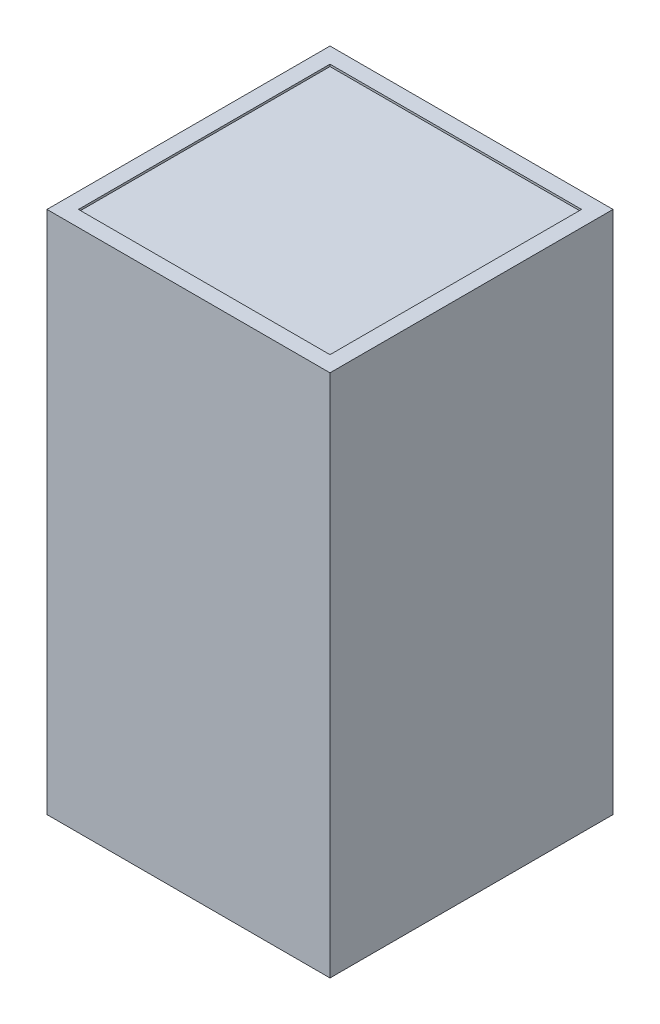
ISO-10303-21;
HEADER;
FILE_DESCRIPTION(('STEP AP214'),'2;1');
FILE_NAME('part.step','',(''),(''),'','','');
FILE_SCHEMA(('AUTOMOTIVE_DESIGN { 1 0 10303 214 1 1 1 1 }'));
ENDSEC;
DATA;
#1=APPLICATION_CONTEXT('core data for automotive mechanical design processes');
#2=APPLICATION_PROTOCOL_DEFINITION('international standard','automotive_design',2000,#1);
#3=PRODUCT_CONTEXT('',#1,'mechanical');
#4=PRODUCT('Part','Part','',(#3));
#5=PRODUCT_RELATED_PRODUCT_CATEGORY('part','',(#4));
#6=PRODUCT_DEFINITION_FORMATION('','',#4);
#7=PRODUCT_DEFINITION_CONTEXT('part definition',#1,'design');
#8=PRODUCT_DEFINITION('design','',#6,#7);
#9=PRODUCT_DEFINITION_SHAPE('','',#8);
#10=(LENGTH_UNIT() NAMED_UNIT(*) SI_UNIT(.MILLI.,.METRE.));
#11=(NAMED_UNIT(*) PLANE_ANGLE_UNIT() SI_UNIT($,.RADIAN.));
#12=(NAMED_UNIT(*) SI_UNIT($,.STERADIAN.) SOLID_ANGLE_UNIT());
#13=UNCERTAINTY_MEASURE_WITH_UNIT(LENGTH_MEASURE(1.E-05),#10,'distance_accuracy_value','');
#14=(GEOMETRIC_REPRESENTATION_CONTEXT(3) GLOBAL_UNCERTAINTY_ASSIGNED_CONTEXT((#13)) GLOBAL_UNIT_ASSIGNED_CONTEXT((#10,
#11,#12)) REPRESENTATION_CONTEXT('',''));
#15=CARTESIAN_POINT('',(0.,0.,0.));
#16=DIRECTION('',(0.,0.,1.));
#17=DIRECTION('',(1.,0.,0.));
#18=AXIS2_PLACEMENT_3D('',#15,#16,#17);
#19=CARTESIAN_POINT('',(0.,500.,0.));
#20=DIRECTION('',(1.,0.,0.));
#21=DIRECTION('',(0.,0.,-1.));
#22=AXIS2_PLACEMENT_3D('',#19,#20,#21);
#23=PLANE('',#22);
#24=DIRECTION('',(0.,0.,1.));
#25=VECTOR('',#24,1.);
#26=CARTESIAN_POINT('',(0.,0.,0.));
#27=LINE('',#26,#25);
#28=CARTESIAN_POINT('',(0.,0.,-270.));
#29=VERTEX_POINT('',#28);
#30=CARTESIAN_POINT('',(0.,0.,0.));
#31=VERTEX_POINT('',#30);
#32=EDGE_CURVE('E140',#29,#31,#27,.T.);
#33=ORIENTED_EDGE('',*,*,#32,.T.);
#34=DIRECTION('',(0.,-1.,0.));
#35=VECTOR('',#34,1.);
#36=CARTESIAN_POINT('',(0.,500.,0.));
#37=LINE('',#36,#35);
#38=CARTESIAN_POINT('',(0.,500.,0.));
#39=VERTEX_POINT('',#38);
#40=EDGE_CURVE('E11',#39,#31,#37,.T.);
#41=ORIENTED_EDGE('',*,*,#40,.F.);
#42=DIRECTION('',(0.,0.,1.));
#43=VECTOR('',#42,1.);
#44=CARTESIAN_POINT('',(0.,500.,0.));
#45=LINE('',#44,#43);
#46=CARTESIAN_POINT('',(0.,500.,-270.));
#47=VERTEX_POINT('',#46);
#48=EDGE_CURVE('E144',#47,#39,#45,.T.);
#49=ORIENTED_EDGE('',*,*,#48,.F.);
#50=DIRECTION('',(0.,-1.,0.));
#51=VECTOR('',#50,1.);
#52=CARTESIAN_POINT('',(0.,500.,-270.));
#53=LINE('',#52,#51);
#54=EDGE_CURVE('E150',#47,#29,#53,.T.);
#55=ORIENTED_EDGE('',*,*,#54,.T.);
#56=EDGE_LOOP('',(#33,#41,#49,#55));
#57=FACE_BOUND('',#56,.T.);
#58=ADVANCED_FACE('F33',(#57),#23,.F.);
#59=CARTESIAN_POINT('',(0.,500.,0.));
#60=DIRECTION('',(0.,0.,-1.));
#61=DIRECTION('',(-1.,0.,0.));
#62=AXIS2_PLACEMENT_3D('',#59,#60,#61);
#63=PLANE('',#62);
#64=DIRECTION('',(1.,0.,0.));
#65=VECTOR('',#64,1.);
#66=CARTESIAN_POINT('',(0.,0.,0.));
#67=LINE('',#66,#65);
#68=CARTESIAN_POINT('',(270.,0.,0.));
#69=VERTEX_POINT('',#68);
#70=EDGE_CURVE('E153',#31,#69,#67,.T.);
#71=ORIENTED_EDGE('',*,*,#70,.T.);
#72=DIRECTION('',(0.,-1.,0.));
#73=VECTOR('',#72,1.);
#74=CARTESIAN_POINT('',(270.,500.,0.));
#75=LINE('',#74,#73);
#76=CARTESIAN_POINT('',(270.,500.,0.));
#77=VERTEX_POINT('',#76);
#78=EDGE_CURVE('E40',#77,#69,#75,.T.);
#79=ORIENTED_EDGE('',*,*,#78,.F.);
#80=DIRECTION('',(1.,0.,0.));
#81=VECTOR('',#80,1.);
#82=CARTESIAN_POINT('',(0.,500.,0.));
#83=LINE('',#82,#81);
#84=EDGE_CURVE('E84',#39,#77,#83,.T.);
#85=ORIENTED_EDGE('',*,*,#84,.F.);
#86=ORIENTED_EDGE('',*,*,#40,.T.);
#87=EDGE_LOOP('',(#71,#79,#85,#86));
#88=FACE_BOUND('',#87,.T.);
#89=ADVANCED_FACE('F183',(#88),#63,.F.);
#90=CARTESIAN_POINT('',(270.,500.,0.));
#91=DIRECTION('',(-1.,0.,0.));
#92=DIRECTION('',(0.,0.,1.));
#93=AXIS2_PLACEMENT_3D('',#90,#91,#92);
#94=PLANE('',#93);
#95=DIRECTION('',(0.,0.,-1.));
#96=VECTOR('',#95,1.);
#97=CARTESIAN_POINT('',(270.,0.,0.));
#98=LINE('',#97,#96);
#99=CARTESIAN_POINT('',(270.,0.,-270.));
#100=VERTEX_POINT('',#99);
#101=EDGE_CURVE('E155',#69,#100,#98,.T.);
#102=ORIENTED_EDGE('',*,*,#101,.T.);
#103=DIRECTION('',(0.,-1.,0.));
#104=VECTOR('',#103,1.);
#105=CARTESIAN_POINT('',(270.,500.,-270.));
#106=LINE('',#105,#104);
#107=CARTESIAN_POINT('',(270.,500.,-270.));
#108=VERTEX_POINT('',#107);
#109=EDGE_CURVE('E159',#108,#100,#106,.T.);
#110=ORIENTED_EDGE('',*,*,#109,.F.);
#111=DIRECTION('',(0.,0.,-1.));
#112=VECTOR('',#111,1.);
#113=CARTESIAN_POINT('',(270.,500.,0.));
#114=LINE('',#113,#112);
#115=EDGE_CURVE('E147',#77,#108,#114,.T.);
#116=ORIENTED_EDGE('',*,*,#115,.F.);
#117=ORIENTED_EDGE('',*,*,#78,.T.);
#118=EDGE_LOOP('',(#102,#110,#116,#117));
#119=FACE_BOUND('',#118,.T.);
#120=ADVANCED_FACE('F164',(#119),#94,.F.);
#121=CARTESIAN_POINT('',(0.,500.,-270.));
#122=DIRECTION('',(0.,0.,1.));
#123=DIRECTION('',(1.,0.,0.));
#124=AXIS2_PLACEMENT_3D('',#121,#122,#123);
#125=PLANE('',#124);
#126=DIRECTION('',(-1.,0.,0.));
#127=VECTOR('',#126,1.);
#128=CARTESIAN_POINT('',(0.,0.,-270.));
#129=LINE('',#128,#127);
#130=EDGE_CURVE('E77',#100,#29,#129,.T.);
#131=ORIENTED_EDGE('',*,*,#130,.T.);
#132=ORIENTED_EDGE('',*,*,#54,.F.);
#133=DIRECTION('',(-1.,0.,0.));
#134=VECTOR('',#133,1.);
#135=CARTESIAN_POINT('',(0.,500.,-270.));
#136=LINE('',#135,#134);
#137=EDGE_CURVE('E56',#108,#47,#136,.T.);
#138=ORIENTED_EDGE('',*,*,#137,.F.);
#139=ORIENTED_EDGE('',*,*,#109,.T.);
#140=EDGE_LOOP('',(#131,#132,#138,#139));
#141=FACE_BOUND('',#140,.T.);
#142=ADVANCED_FACE('F172',(#141),#125,.F.);
#143=CARTESIAN_POINT('',(0.,500.,0.));
#144=DIRECTION('',(0.,-1.,0.));
#145=DIRECTION('',(0.,0.,-1.));
#146=AXIS2_PLACEMENT_3D('',#143,#144,#145);
#147=PLANE('',#146);
#148=DIRECTION('',(0.,0.,1.));
#149=VECTOR('',#148,1.);
#150=CARTESIAN_POINT('',(15.,500.,0.));
#151=LINE('',#150,#149);
#152=CARTESIAN_POINT('',(15.,500.,-255.));
#153=VERTEX_POINT('',#152);
#154=CARTESIAN_POINT('',(15.,500.,-15.));
#155=VERTEX_POINT('',#154);
#156=EDGE_CURVE('E134',#153,#155,#151,.T.);
#157=ORIENTED_EDGE('',*,*,#156,.F.);
#158=DIRECTION('',(-1.,0.,0.));
#159=VECTOR('',#158,1.);
#160=CARTESIAN_POINT('',(0.,500.,-255.));
#161=LINE('',#160,#159);
#162=CARTESIAN_POINT('',(255.,500.,-255.));
#163=VERTEX_POINT('',#162);
#164=EDGE_CURVE('E47',#163,#153,#161,.T.);
#165=ORIENTED_EDGE('',*,*,#164,.F.);
#166=DIRECTION('',(0.,0.,1.));
#167=VECTOR('',#166,1.);
#168=CARTESIAN_POINT('',(255.,500.,0.));
#169=LINE('',#168,#167);
#170=CARTESIAN_POINT('',(255.,500.,-15.));
#171=VERTEX_POINT('',#170);
#172=EDGE_CURVE('E125',#163,#171,#169,.T.);
#173=ORIENTED_EDGE('',*,*,#172,.T.);
#174=DIRECTION('',(-1.,0.,0.));
#175=VECTOR('',#174,1.);
#176=CARTESIAN_POINT('',(0.,500.,-15.));
#177=LINE('',#176,#175);
#178=EDGE_CURVE('E128',#171,#155,#177,.T.);
#179=ORIENTED_EDGE('',*,*,#178,.T.);
#180=EDGE_LOOP('',(#157,#165,#173,#179));
#181=FACE_BOUND('',#180,.T.);
#182=ORIENTED_EDGE('',*,*,#48,.T.);
#183=ORIENTED_EDGE('',*,*,#84,.T.);
#184=ORIENTED_EDGE('',*,*,#115,.T.);
#185=ORIENTED_EDGE('',*,*,#137,.T.);
#186=EDGE_LOOP('',(#182,#183,#184,#185));
#187=FACE_BOUND('',#186,.T.);
#188=ADVANCED_FACE('F174',(#181,#187),#147,.F.);
#189=CARTESIAN_POINT('',(0.,0.,0.));
#190=DIRECTION('',(0.,-1.,0.));
#191=DIRECTION('',(0.,0.,-1.));
#192=AXIS2_PLACEMENT_3D('',#189,#190,#191);
#193=PLANE('',#192);
#194=ORIENTED_EDGE('',*,*,#32,.F.);
#195=ORIENTED_EDGE('',*,*,#130,.F.);
#196=ORIENTED_EDGE('',*,*,#101,.F.);
#197=ORIENTED_EDGE('',*,*,#70,.F.);
#198=EDGE_LOOP('',(#194,#195,#196,#197));
#199=FACE_BOUND('',#198,.T.);
#200=ADVANCED_FACE('F168',(#199),#193,.T.);
#201=CARTESIAN_POINT('',(0.,498.,-255.));
#202=DIRECTION('',(0.,0.,-1.));
#203=DIRECTION('',(-1.,0.,0.));
#204=AXIS2_PLACEMENT_3D('',#201,#202,#203);
#205=PLANE('',#204);
#206=ORIENTED_EDGE('',*,*,#164,.T.);
#207=DIRECTION('',(0.,1.,0.));
#208=VECTOR('',#207,1.);
#209=CARTESIAN_POINT('',(15.,498.,-255.));
#210=LINE('',#209,#208);
#211=CARTESIAN_POINT('',(15.,498.,-255.));
#212=VERTEX_POINT('',#211);
#213=EDGE_CURVE('E104',#212,#153,#210,.T.);
#214=ORIENTED_EDGE('',*,*,#213,.F.);
#215=DIRECTION('',(-1.,0.,0.));
#216=VECTOR('',#215,1.);
#217=CARTESIAN_POINT('',(0.,498.,-255.));
#218=LINE('',#217,#216);
#219=CARTESIAN_POINT('',(255.,498.,-255.));
#220=VERTEX_POINT('',#219);
#221=EDGE_CURVE('E108',#220,#212,#218,.T.);
#222=ORIENTED_EDGE('',*,*,#221,.F.);
#223=DIRECTION('',(0.,1.,0.));
#224=VECTOR('',#223,1.);
#225=CARTESIAN_POINT('',(255.,498.,-255.));
#226=LINE('',#225,#224);
#227=EDGE_CURVE('E138',#220,#163,#226,.T.);
#228=ORIENTED_EDGE('',*,*,#227,.T.);
#229=EDGE_LOOP('',(#206,#214,#222,#228));
#230=FACE_BOUND('',#229,.T.);
#231=ADVANCED_FACE('F106',(#230),#205,.F.);
#232=CARTESIAN_POINT('',(255.,498.,0.));
#233=DIRECTION('',(-1.,0.,0.));
#234=DIRECTION('',(0.,0.,1.));
#235=AXIS2_PLACEMENT_3D('',#232,#233,#234);
#236=PLANE('',#235);
#237=ORIENTED_EDGE('',*,*,#172,.F.);
#238=ORIENTED_EDGE('',*,*,#227,.F.);
#239=DIRECTION('',(0.,0.,1.));
#240=VECTOR('',#239,1.);
#241=CARTESIAN_POINT('',(255.,498.,0.));
#242=LINE('',#241,#240);
#243=CARTESIAN_POINT('',(255.,498.,-15.));
#244=VERTEX_POINT('',#243);
#245=EDGE_CURVE('E113',#220,#244,#242,.T.);
#246=ORIENTED_EDGE('',*,*,#245,.T.);
#247=DIRECTION('',(0.,1.,0.));
#248=VECTOR('',#247,1.);
#249=CARTESIAN_POINT('',(255.,498.,-15.));
#250=LINE('',#249,#248);
#251=EDGE_CURVE('E141',#244,#171,#250,.T.);
#252=ORIENTED_EDGE('',*,*,#251,.T.);
#253=EDGE_LOOP('',(#237,#238,#246,#252));
#254=FACE_BOUND('',#253,.T.);
#255=ADVANCED_FACE('F219',(#254),#236,.T.);
#256=CARTESIAN_POINT('',(0.,498.,-15.));
#257=DIRECTION('',(0.,0.,-1.));
#258=DIRECTION('',(-1.,0.,0.));
#259=AXIS2_PLACEMENT_3D('',#256,#257,#258);
#260=PLANE('',#259);
#261=ORIENTED_EDGE('',*,*,#178,.F.);
#262=ORIENTED_EDGE('',*,*,#251,.F.);
#263=DIRECTION('',(-1.,0.,0.));
#264=VECTOR('',#263,1.);
#265=CARTESIAN_POINT('',(0.,498.,-15.));
#266=LINE('',#265,#264);
#267=CARTESIAN_POINT('',(15.,498.,-15.));
#268=VERTEX_POINT('',#267);
#269=EDGE_CURVE('E121',#244,#268,#266,.T.);
#270=ORIENTED_EDGE('',*,*,#269,.T.);
#271=DIRECTION('',(0.,1.,0.));
#272=VECTOR('',#271,1.);
#273=CARTESIAN_POINT('',(15.,498.,-15.));
#274=LINE('',#273,#272);
#275=EDGE_CURVE('E112',#268,#155,#274,.T.);
#276=ORIENTED_EDGE('',*,*,#275,.T.);
#277=EDGE_LOOP('',(#261,#262,#270,#276));
#278=FACE_BOUND('',#277,.T.);
#279=ADVANCED_FACE('F228',(#278),#260,.T.);
#280=CARTESIAN_POINT('',(15.,498.,0.));
#281=DIRECTION('',(-1.,0.,0.));
#282=DIRECTION('',(0.,0.,1.));
#283=AXIS2_PLACEMENT_3D('',#280,#281,#282);
#284=PLANE('',#283);
#285=ORIENTED_EDGE('',*,*,#156,.T.);
#286=ORIENTED_EDGE('',*,*,#275,.F.);
#287=DIRECTION('',(0.,0.,1.));
#288=VECTOR('',#287,1.);
#289=CARTESIAN_POINT('',(15.,498.,0.));
#290=LINE('',#289,#288);
#291=EDGE_CURVE('E117',#212,#268,#290,.T.);
#292=ORIENTED_EDGE('',*,*,#291,.F.);
#293=ORIENTED_EDGE('',*,*,#213,.T.);
#294=EDGE_LOOP('',(#285,#286,#292,#293));
#295=FACE_BOUND('',#294,.T.);
#296=ADVANCED_FACE('F118',(#295),#284,.F.);
#297=CARTESIAN_POINT('',(0.,498.,0.));
#298=DIRECTION('',(0.,1.,0.));
#299=DIRECTION('',(0.,0.,1.));
#300=AXIS2_PLACEMENT_3D('',#297,#298,#299);
#301=PLANE('',#300);
#302=ORIENTED_EDGE('',*,*,#221,.T.);
#303=ORIENTED_EDGE('',*,*,#291,.T.);
#304=ORIENTED_EDGE('',*,*,#269,.F.);
#305=ORIENTED_EDGE('',*,*,#245,.F.);
#306=EDGE_LOOP('',(#302,#303,#304,#305));
#307=FACE_BOUND('',#306,.T.);
#308=ADVANCED_FACE('F124',(#307),#301,.T.);
#309=CLOSED_SHELL('',(#58,#89,#120,#142,#188,#200,#231,#255,#279,#296,#308));
#310=MANIFOLD_SOLID_BREP('B2',#309);
#311=ADVANCED_BREP_SHAPE_REPRESENTATION('',(#18,#310),#14);
#312=SHAPE_DEFINITION_REPRESENTATION(#9,#311);
ENDSEC;
END-ISO-10303-21;
